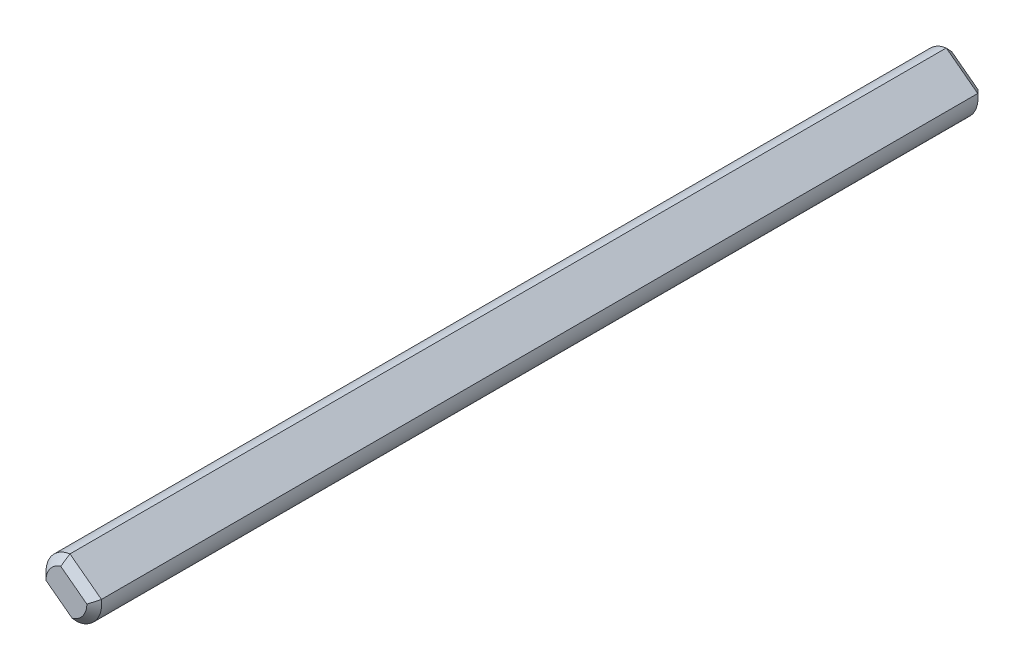
ISO-10303-21;
HEADER;
FILE_DESCRIPTION(('STEP AP214'),'2;1');
FILE_NAME('part.step','',(''),(''),'','','');
FILE_SCHEMA(('AUTOMOTIVE_DESIGN { 1 0 10303 214 1 1 1 1 }'));
ENDSEC;
DATA;
#1=APPLICATION_CONTEXT('core data for automotive mechanical design processes');
#2=APPLICATION_PROTOCOL_DEFINITION('international standard','automotive_design',2000,#1);
#3=PRODUCT_CONTEXT('',#1,'mechanical');
#4=PRODUCT('Part','Part','',(#3));
#5=PRODUCT_RELATED_PRODUCT_CATEGORY('part','',(#4));
#6=PRODUCT_DEFINITION_FORMATION('','',#4);
#7=PRODUCT_DEFINITION_CONTEXT('part definition',#1,'design');
#8=PRODUCT_DEFINITION('design','',#6,#7);
#9=PRODUCT_DEFINITION_SHAPE('','',#8);
#10=(LENGTH_UNIT() NAMED_UNIT(*) SI_UNIT(.MILLI.,.METRE.));
#11=(NAMED_UNIT(*) PLANE_ANGLE_UNIT() SI_UNIT($,.RADIAN.));
#12=(NAMED_UNIT(*) SI_UNIT($,.STERADIAN.) SOLID_ANGLE_UNIT());
#13=UNCERTAINTY_MEASURE_WITH_UNIT(LENGTH_MEASURE(1.E-05),#10,'distance_accuracy_value','');
#14=(GEOMETRIC_REPRESENTATION_CONTEXT(3) GLOBAL_UNCERTAINTY_ASSIGNED_CONTEXT((#13)) GLOBAL_UNIT_ASSIGNED_CONTEXT((#10,
#11,#12)) REPRESENTATION_CONTEXT('',''));
#15=CARTESIAN_POINT('',(0.,0.,0.));
#16=DIRECTION('',(0.,0.,1.));
#17=DIRECTION('',(1.,0.,0.));
#18=AXIS2_PLACEMENT_3D('',#15,#16,#17);
#19=CARTESIAN_POINT('',(-4.13463688797048,-5.48954506721514,120.));
#20=DIRECTION('',(0.601626417089514,0.798777599998919,0.));
#21=DIRECTION('',(-0.798777599998919,0.601626417089514,0.));
#22=AXIS2_PLACEMENT_3D('',#19,#20,#21);
#23=PLANE('',#22);
#24=DIRECTION('',(0.,0.,-1.));
#25=VECTOR('',#24,1.);
#26=CARTESIAN_POINT('',(-20.4167449950073,6.77387639467103,120.));
#27=LINE('',#26,#25);
#28=CARTESIAN_POINT('',(-20.4167449950073,6.77387639467103,119.));
#29=VERTEX_POINT('',#28);
#30=CARTESIAN_POINT('',(-20.4167449950073,6.77387639467103,1.));
#31=VERTEX_POINT('',#30);
#32=EDGE_CURVE('E141',#29,#31,#27,.T.);
#33=ORIENTED_EDGE('',*,*,#32,.F.);
#34=DIRECTION('',(0.798777599998919,-0.601626417089514,0.));
#35=VECTOR('',#34,1.);
#36=CARTESIAN_POINT('',(-4.13463688797048,-5.48954506721514,119.));
#37=LINE('',#36,#35);
#38=CARTESIAN_POINT('',(-16.1805870628636,3.58327050018382,119.));
#39=VERTEX_POINT('',#38);
#40=EDGE_CURVE('E174',#29,#39,#37,.T.);
#41=ORIENTED_EDGE('',*,*,#40,.T.);
#42=DIRECTION('',(0.,0.,-1.));
#43=VECTOR('',#42,1.);
#44=CARTESIAN_POINT('',(-16.1805870628636,3.58327050018382,120.));
#45=LINE('',#44,#43);
#46=CARTESIAN_POINT('',(-16.1805870628636,3.58327050018382,1.));
#47=VERTEX_POINT('',#46);
#48=EDGE_CURVE('E227',#39,#47,#45,.T.);
#49=ORIENTED_EDGE('',*,*,#48,.T.);
#50=DIRECTION('',(-0.798777599998919,0.601626417089514,0.));
#51=VECTOR('',#50,1.);
#52=CARTESIAN_POINT('',(-20.4167449950073,6.77387639467103,0.999999999999998));
#53=LINE('',#52,#51);
#54=EDGE_CURVE('E171',#47,#31,#53,.T.);
#55=ORIENTED_EDGE('',*,*,#54,.T.);
#56=EDGE_LOOP('',(#33,#41,#49,#55));
#57=FACE_BOUND('',#56,.T.);
#58=ADVANCED_FACE('F47',(#57),#23,.T.);
#59=CARTESIAN_POINT('',(-19.8939689761791,3.06049448135561,120.));
#60=DIRECTION('',(0.,0.,-1.));
#61=DIRECTION('',(-1.,0.,0.));
#62=AXIS2_PLACEMENT_3D('',#59,#60,#61);
#63=CYLINDRICAL_SURFACE('',#62,3.75);
#64=DIRECTION('',(0.,0.,-1.));
#65=VECTOR('',#64,1.);
#66=CARTESIAN_POINT('',(-23.6073508894945,2.5377184625274,120.));
#67=LINE('',#66,#65);
#68=CARTESIAN_POINT('',(-23.6073508894945,2.5377184625274,119.));
#69=VERTEX_POINT('',#68);
#70=CARTESIAN_POINT('',(-23.6073508894945,2.5377184625274,1.));
#71=VERTEX_POINT('',#70);
#72=EDGE_CURVE('E434',#69,#71,#67,.T.);
#73=ORIENTED_EDGE('',*,*,#72,.F.);
#74=CARTESIAN_POINT('',(-19.8939689761791,3.06049448135561,119.));
#75=DIRECTION('',(0.,0.,1.));
#76=DIRECTION('',(1.,0.,0.));
#77=AXIS2_PLACEMENT_3D('',#74,#75,#76);
#78=CIRCLE('',#77,3.75);
#79=EDGE_CURVE('E168',#69,#29,#78,.F.);
#80=ORIENTED_EDGE('',*,*,#79,.T.);
#81=ORIENTED_EDGE('',*,*,#32,.T.);
#82=CARTESIAN_POINT('',(-19.8939689761791,3.06049448135561,1.));
#83=DIRECTION('',(0.,0.,1.));
#84=DIRECTION('',(1.,0.,0.));
#85=AXIS2_PLACEMENT_3D('',#82,#83,#84);
#86=CIRCLE('',#85,3.75);
#87=EDGE_CURVE('E164',#31,#71,#86,.T.);
#88=ORIENTED_EDGE('',*,*,#87,.T.);
#89=EDGE_LOOP('',(#73,#80,#81,#88));
#90=FACE_BOUND('',#89,.T.);
#91=ADVANCED_FACE('F272',(#90),#63,.T.);
#92=CARTESIAN_POINT('',(-7.32524278245773,-9.72570299935879,120.));
#93=DIRECTION('',(-0.601626417089516,-0.798777599998918,0.));
#94=DIRECTION('',(0.798777599998919,-0.601626417089516,0.));
#95=AXIS2_PLACEMENT_3D('',#92,#93,#94);
#96=PLANE('',#95);
#97=DIRECTION('',(0.,0.,-1.));
#98=VECTOR('',#97,1.);
#99=CARTESIAN_POINT('',(-19.3711929573509,-0.652887431959822,120.));
#100=LINE('',#99,#98);
#101=CARTESIAN_POINT('',(-19.3711929573509,-0.652887431959822,119.));
#102=VERTEX_POINT('',#101);
#103=CARTESIAN_POINT('',(-19.3711929573509,-0.652887431959822,1.));
#104=VERTEX_POINT('',#103);
#105=EDGE_CURVE('E430',#102,#104,#100,.T.);
#106=ORIENTED_EDGE('',*,*,#105,.F.);
#107=DIRECTION('',(-0.798777599998919,0.601626417089516,0.));
#108=VECTOR('',#107,1.);
#109=CARTESIAN_POINT('',(-7.32524278245773,-9.72570299935879,119.));
#110=LINE('',#109,#108);
#111=EDGE_CURVE('E162',#102,#69,#110,.T.);
#112=ORIENTED_EDGE('',*,*,#111,.T.);
#113=ORIENTED_EDGE('',*,*,#72,.T.);
#114=DIRECTION('',(0.798777599998919,-0.601626417089516,0.));
#115=VECTOR('',#114,1.);
#116=CARTESIAN_POINT('',(-19.3711929573509,-0.652887431959823,1.));
#117=LINE('',#116,#115);
#118=EDGE_CURVE('E159',#71,#104,#117,.T.);
#119=ORIENTED_EDGE('',*,*,#118,.T.);
#120=EDGE_LOOP('',(#106,#112,#113,#119));
#121=FACE_BOUND('',#120,.T.);
#122=ADVANCED_FACE('F277',(#121),#96,.T.);
#123=ORIENTED_EDGE('',*,*,#48,.F.);
#124=CARTESIAN_POINT('',(-19.8939689761791,3.06049448135561,119.));
#125=DIRECTION('',(0.,0.,1.));
#126=DIRECTION('',(1.,0.,0.));
#127=AXIS2_PLACEMENT_3D('',#124,#125,#126);
#128=CIRCLE('',#127,3.75);
#129=EDGE_CURVE('E126',#39,#102,#128,.F.);
#130=ORIENTED_EDGE('',*,*,#129,.T.);
#131=ORIENTED_EDGE('',*,*,#105,.T.);
#132=CARTESIAN_POINT('',(-19.8939689761791,3.06049448135561,1.));
#133=DIRECTION('',(0.,0.,1.));
#134=DIRECTION('',(1.,0.,0.));
#135=AXIS2_PLACEMENT_3D('',#132,#133,#134);
#136=CIRCLE('',#135,3.75);
#137=EDGE_CURVE('E148',#104,#47,#136,.T.);
#138=ORIENTED_EDGE('',*,*,#137,.T.);
#139=EDGE_LOOP('',(#123,#130,#131,#138));
#140=FACE_BOUND('',#139,.T.);
#141=ADVANCED_FACE('F280',(#140),#63,.T.);
#142=CARTESIAN_POINT('',(0.,0.,120.));
#143=DIRECTION('',(0.,0.,1.));
#144=DIRECTION('',(1.,0.,0.));
#145=AXIS2_PLACEMENT_3D('',#142,#143,#144);
#146=PLANE('',#145);
#147=DIRECTION('',(0.798777599998918,-0.601626417089516,0.));
#148=VECTOR('',#147,1.);
#149=CARTESIAN_POINT('',(-6.72361636536821,-8.92692539935987,120.));
#150=LINE('',#149,#148);
#151=CARTESIAN_POINT('',(-22.6439667086819,3.06402594413125,120.));
#152=VERTEX_POINT('',#151);
#153=CARTESIAN_POINT('',(-19.1313243039844,0.418360286434179,120.));
#154=VERTEX_POINT('',#153);
#155=EDGE_CURVE('E145',#152,#154,#150,.T.);
#156=ORIENTED_EDGE('',*,*,#155,.T.);
#157=CARTESIAN_POINT('',(-19.8939689761791,3.06049448135561,120.));
#158=DIRECTION('',(0.,0.,1.));
#159=DIRECTION('',(1.,0.,0.));
#160=AXIS2_PLACEMENT_3D('',#157,#158,#159);
#161=CIRCLE('',#160,2.74999999999999);
#162=CARTESIAN_POINT('',(-17.1439712436762,3.05696301857997,120.));
#163=VERTEX_POINT('',#162);
#164=EDGE_CURVE('E124',#154,#163,#161,.T.);
#165=ORIENTED_EDGE('',*,*,#164,.T.);
#166=DIRECTION('',(-0.798777599998919,0.601626417089514,0.));
#167=VECTOR('',#166,1.);
#168=CARTESIAN_POINT('',(-4.73626330506,-6.28832266721407,120.));
#169=LINE('',#168,#167);
#170=CARTESIAN_POINT('',(-20.6566136483737,5.70262867627704,120.));
#171=VERTEX_POINT('',#170);
#172=EDGE_CURVE('E133',#163,#171,#169,.T.);
#173=ORIENTED_EDGE('',*,*,#172,.T.);
#174=CARTESIAN_POINT('',(-19.8939689761791,3.06049448135561,120.));
#175=DIRECTION('',(0.,0.,1.));
#176=DIRECTION('',(1.,0.,0.));
#177=AXIS2_PLACEMENT_3D('',#174,#175,#176);
#178=CIRCLE('',#177,2.75);
#179=EDGE_CURVE('E140',#171,#152,#178,.T.);
#180=ORIENTED_EDGE('',*,*,#179,.T.);
#181=EDGE_LOOP('',(#156,#165,#173,#180));
#182=FACE_BOUND('',#181,.T.);
#183=ADVANCED_FACE('F143',(#182),#146,.T.);
#184=CARTESIAN_POINT('',(0.,0.,0.));
#185=DIRECTION('',(0.,0.,1.));
#186=DIRECTION('',(1.,0.,0.));
#187=AXIS2_PLACEMENT_3D('',#184,#185,#186);
#188=PLANE('',#187);
#189=DIRECTION('',(-0.798777599998918,0.601626417089516,0.));
#190=VECTOR('',#189,1.);
#191=CARTESIAN_POINT('',(-23.005724472405,3.33649606252632,0.));
#192=LINE('',#191,#190);
#193=CARTESIAN_POINT('',(-19.1313243039844,0.418360286434177,0.));
#194=VERTEX_POINT('',#193);
#195=CARTESIAN_POINT('',(-22.6439667086819,3.06402594413124,0.));
#196=VERTEX_POINT('',#195);
#197=EDGE_CURVE('E63',#194,#196,#192,.T.);
#198=ORIENTED_EDGE('',*,*,#197,.T.);
#199=CARTESIAN_POINT('',(-19.8939689761791,3.06049448135561,0.));
#200=DIRECTION('',(0.,0.,1.));
#201=DIRECTION('',(1.,0.,0.));
#202=AXIS2_PLACEMENT_3D('',#199,#200,#201);
#203=CIRCLE('',#202,2.75);
#204=CARTESIAN_POINT('',(-20.6566136483737,5.70262867627704,0.));
#205=VERTEX_POINT('',#204);
#206=EDGE_CURVE('E11',#196,#205,#203,.F.);
#207=ORIENTED_EDGE('',*,*,#206,.T.);
#208=DIRECTION('',(0.798777599998919,-0.601626417089514,0.));
#209=VECTOR('',#208,1.);
#210=CARTESIAN_POINT('',(-16.7822134799531,2.7844929001849,0.));
#211=LINE('',#210,#209);
#212=CARTESIAN_POINT('',(-17.1439712436762,3.05696301857998,0.));
#213=VERTEX_POINT('',#212);
#214=EDGE_CURVE('E177',#205,#213,#211,.T.);
#215=ORIENTED_EDGE('',*,*,#214,.T.);
#216=CARTESIAN_POINT('',(-19.8939689761791,3.06049448135561,0.));
#217=DIRECTION('',(0.,0.,1.));
#218=DIRECTION('',(1.,0.,0.));
#219=AXIS2_PLACEMENT_3D('',#216,#217,#218);
#220=CIRCLE('',#219,2.75);
#221=EDGE_CURVE('E74',#213,#194,#220,.F.);
#222=ORIENTED_EDGE('',*,*,#221,.T.);
#223=EDGE_LOOP('',(#198,#207,#215,#222));
#224=FACE_BOUND('',#223,.T.);
#225=ADVANCED_FACE('F288',(#224),#188,.F.);
#226=CARTESIAN_POINT('',(-19.8939689761791,3.06049448135561,120.));
#227=DIRECTION('',(0.,0.,-1.));
#228=DIRECTION('',(-1.,0.,0.));
#229=AXIS2_PLACEMENT_3D('',#226,#227,#228);
#230=CONICAL_SURFACE('',#229,2.74999999999999,0.785398163397443);
#231=CARTESIAN_POINT('',(-20.4167449950073,6.77387639467103,119.));
#232=CARTESIAN_POINT('',(-20.4394814246317,6.68585597824511,119.083987573676));
#233=CARTESIAN_POINT('',(-20.4616448685273,6.59756330900758,119.167847893448));
#234=CARTESIAN_POINT('',(-20.5046589579363,6.42038941817363,119.335248841247));
#235=CARTESIAN_POINT('',(-20.5255098435853,6.3315083075416,119.418789525109));
#236=CARTESIAN_POINT('',(-20.5657418231416,6.1530751523399,119.585522554294));
#237=CARTESIAN_POINT('',(-20.5851228168197,6.06352306247407,119.668714875498));
#238=CARTESIAN_POINT('',(-20.6221936992378,5.88366023134805,119.834688098241));
#239=CARTESIAN_POINT('',(-20.6398832763401,5.79334935360552,119.91746892131));
#240=CARTESIAN_POINT('',(-20.6566136483737,5.70262867627704,120.));
#241=B_SPLINE_CURVE_WITH_KNOTS('',3,(#231,#232,#233,#234,#235,#236,#237,#238,#239,#240),
.UNSPECIFIED.,.F.,.F.,(4,2,2,2,4),(0.,0.371304347450878,0.742540565331989,1.11380207441254,
1.48513185589644),.UNSPECIFIED.);
#242=EDGE_CURVE('E136',#29,#171,#241,.T.);
#243=ORIENTED_EDGE('',*,*,#242,.F.);
#244=ORIENTED_EDGE('',*,*,#79,.F.);
#245=CARTESIAN_POINT('',(-23.6073508894945,2.5377184625274,119.));
#246=CARTESIAN_POINT('',(-23.5290290330575,2.58387283116276,119.083987573676));
#247=CARTESIAN_POINT('',(-23.4502873095119,2.62955165185092,119.167847893448));
#248=CARTESIAN_POINT('',(-23.2918757340383,2.71981001565679,119.335248841247));
#249=CARTESIAN_POINT('',(-23.212206055061,2.76438975893988,119.418789525109));
#250=CARTESIAN_POINT('',(-23.0518160446991,2.85232182152426,119.585522554294));
#251=CARTESIAN_POINT('',(-22.9710956421064,2.89567405699795,119.668714875498));
#252=CARTESIAN_POINT('',(-22.8084587738607,2.98096261092611,119.834688098241));
#253=CARTESIAN_POINT('',(-22.7265420909897,3.02289866753726,119.91746892131));
#254=CARTESIAN_POINT('',(-22.6439667086819,3.06402594413125,120.));
#255=B_SPLINE_CURVE_WITH_KNOTS('',3,(#245,#246,#247,#248,#249,#250,#251,#252,#253,#254),
.UNSPECIFIED.,.F.,.F.,(4,2,2,2,4),(0.,0.37130434745088,0.742540565331995,1.11380207441255,
1.48513185589644),.UNSPECIFIED.);
#256=EDGE_CURVE('E219',#152,#69,#255,.F.);
#257=ORIENTED_EDGE('',*,*,#256,.F.);
#258=ORIENTED_EDGE('',*,*,#179,.F.);
#259=EDGE_LOOP('',(#243,#244,#257,#258));
#260=FACE_BOUND('',#259,.T.);
#261=ADVANCED_FACE('F213',(#260),#230,.T.);
#262=CARTESIAN_POINT('',(-7.32524278245773,-9.72570299935879,119.));
#263=DIRECTION('',(0.425414119264964,0.564821057619153,-0.707106781186545));
#264=DIRECTION('',(-0.798777599998919,0.601626417089516,0.));
#265=AXIS2_PLACEMENT_3D('',#262,#263,#264);
#266=PLANE('',#265);
#267=ORIENTED_EDGE('',*,*,#256,.T.);
#268=ORIENTED_EDGE('',*,*,#111,.F.);
#269=CARTESIAN_POINT('',(-19.3711929573509,-0.652887431959819,119.));
#270=CARTESIAN_POINT('',(-19.3484565277264,-0.564867015533895,119.083987573676));
#271=CARTESIAN_POINT('',(-19.3262930838308,-0.476574346296363,119.167847893448));
#272=CARTESIAN_POINT('',(-19.2832789944218,-0.299400455462417,119.335248841247));
#273=CARTESIAN_POINT('',(-19.2624281087729,-0.210519344830382,119.418789525109));
#274=CARTESIAN_POINT('',(-19.2221961292166,-0.0320861896286836,119.585522554294));
#275=CARTESIAN_POINT('',(-19.2028151355384,0.0574659002371548,119.668714875498));
#276=CARTESIAN_POINT('',(-19.1657442531203,0.237328731363176,119.834688098241));
#277=CARTESIAN_POINT('',(-19.1480546760181,0.327639609105709,119.91746892131));
#278=CARTESIAN_POINT('',(-19.1313243039844,0.418360286434178,120.));
#279=B_SPLINE_CURVE_WITH_KNOTS('',3,(#269,#270,#271,#272,#273,#274,#275,#276,#277,#278),
.UNSPECIFIED.,.F.,.F.,(4,2,2,2,4),(0.,0.371304347450878,0.742540565331989,1.11380207441255,
1.48513185589644),.UNSPECIFIED.);
#280=EDGE_CURVE('E130',#154,#102,#279,.F.);
#281=ORIENTED_EDGE('',*,*,#280,.F.);
#282=ORIENTED_EDGE('',*,*,#155,.F.);
#283=EDGE_LOOP('',(#267,#268,#281,#282));
#284=FACE_BOUND('',#283,.T.);
#285=ADVANCED_FACE('F205',(#284),#266,.F.);
#286=CARTESIAN_POINT('',(-4.13463688797048,-5.48954506721514,119.));
#287=DIRECTION('',(-0.425414119264963,-0.564821057619153,-0.707106781186545));
#288=DIRECTION('',(0.798777599998919,-0.601626417089514,0.));
#289=AXIS2_PLACEMENT_3D('',#286,#287,#288);
#290=PLANE('',#289);
#291=ORIENTED_EDGE('',*,*,#242,.T.);
#292=ORIENTED_EDGE('',*,*,#172,.F.);
#293=CARTESIAN_POINT('',(-17.1439712436762,3.05696301857997,120.));
#294=CARTESIAN_POINT('',(-17.0613958613684,3.09809029517396,119.91746892131));
#295=CARTESIAN_POINT('',(-16.9794791784974,3.14002635178512,119.834688098241));
#296=CARTESIAN_POINT('',(-16.8168423102517,3.22531490571327,119.668714875498));
#297=CARTESIAN_POINT('',(-16.736121907659,3.26866714118696,119.585522554294));
#298=CARTESIAN_POINT('',(-16.5757318972971,3.35659920377134,119.418789525109));
#299=CARTESIAN_POINT('',(-16.4960622183198,3.40117894705443,119.335248841247));
#300=CARTESIAN_POINT('',(-16.3376506428462,3.4914373108603,119.167847893448));
#301=CARTESIAN_POINT('',(-16.2589089193006,3.53711613154847,119.083987573676));
#302=CARTESIAN_POINT('',(-16.1805870628636,3.58327050018383,119.));
#303=B_SPLINE_CURVE_WITH_KNOTS('',3,(#293,#294,#295,#296,#297,#298,#299,#300,#301,#302),
.UNSPECIFIED.,.F.,.F.,(4,2,2,2,4),(0.,0.371329781483893,0.742591290564448,1.11382750844556,
1.48513185589645),.UNSPECIFIED.);
#304=EDGE_CURVE('E120',#39,#163,#303,.F.);
#305=ORIENTED_EDGE('',*,*,#304,.F.);
#306=ORIENTED_EDGE('',*,*,#40,.F.);
#307=EDGE_LOOP('',(#291,#292,#305,#306));
#308=FACE_BOUND('',#307,.T.);
#309=ADVANCED_FACE('F134',(#308),#290,.F.);
#310=CARTESIAN_POINT('',(-19.8939689761791,3.06049448135561,120.));
#311=DIRECTION('',(0.,0.,-1.));
#312=DIRECTION('',(-1.,0.,0.));
#313=AXIS2_PLACEMENT_3D('',#310,#311,#312);
#314=CONICAL_SURFACE('',#313,2.74999999999999,0.785398163397444);
#315=ORIENTED_EDGE('',*,*,#280,.T.);
#316=ORIENTED_EDGE('',*,*,#129,.F.);
#317=ORIENTED_EDGE('',*,*,#304,.T.);
#318=ORIENTED_EDGE('',*,*,#164,.F.);
#319=EDGE_LOOP('',(#315,#316,#317,#318));
#320=FACE_BOUND('',#319,.T.);
#321=ADVANCED_FACE('F122',(#320),#314,.T.);
#322=CARTESIAN_POINT('',(-19.8939689761791,3.06049448135561,1.));
#323=DIRECTION('',(0.,0.,1.));
#324=DIRECTION('',(1.,0.,0.));
#325=AXIS2_PLACEMENT_3D('',#322,#323,#324);
#326=CONICAL_SURFACE('',#325,3.75,0.78539816339745);
#327=CARTESIAN_POINT('',(-19.3711929573509,-0.652887431959819,1.));
#328=CARTESIAN_POINT('',(-19.3484565277264,-0.564867015533898,0.916012426324013));
#329=CARTESIAN_POINT('',(-19.3262930838308,-0.476574346296368,0.832152106551726));
#330=CARTESIAN_POINT('',(-19.2832789944218,-0.299400455462421,0.664751158753382));
#331=CARTESIAN_POINT('',(-19.2624281087729,-0.210519344830384,0.581210474891373));
#332=CARTESIAN_POINT('',(-19.2221961292166,-0.0320861896286849,0.414477445706256));
#333=CARTESIAN_POINT('',(-19.2028151355385,0.0574659002371522,0.331285124502135));
#334=CARTESIAN_POINT('',(-19.1657442531203,0.237328731363172,0.165311901758703));
#335=CARTESIAN_POINT('',(-19.1480546760181,0.327639609105705,0.0825310786898855));
#336=CARTESIAN_POINT('',(-19.1313243039844,0.418360286434176,0.));
#337=B_SPLINE_CURVE_WITH_KNOTS('',3,(#327,#328,#329,#330,#331,#332,#333,#334,#335,#336),
.UNSPECIFIED.,.F.,.F.,(4,2,2,2,4),(0.,0.371304347450866,0.742540565331981,1.11380207441254,
1.48513185589643),.UNSPECIFIED.);
#338=EDGE_CURVE('E445',#194,#104,#337,.F.);
#339=ORIENTED_EDGE('',*,*,#338,.F.);
#340=ORIENTED_EDGE('',*,*,#221,.F.);
#341=CARTESIAN_POINT('',(-16.1805870628636,3.58327050018382,1.));
#342=CARTESIAN_POINT('',(-16.2589089193006,3.53711613154847,0.916012426324014));
#343=CARTESIAN_POINT('',(-16.3376506428462,3.4914373108603,0.832152106551729));
#344=CARTESIAN_POINT('',(-16.4960622183198,3.40117894705444,0.664751158753385));
#345=CARTESIAN_POINT('',(-16.5757318972971,3.35659920377135,0.581210474891375));
#346=CARTESIAN_POINT('',(-16.736121907659,3.26866714118697,0.414477445706258));
#347=CARTESIAN_POINT('',(-16.8168423102517,3.22531490571327,0.331285124502136));
#348=CARTESIAN_POINT('',(-16.9794791784974,3.14002635178512,0.165311901758704));
#349=CARTESIAN_POINT('',(-17.0613958613684,3.09809029517397,0.0825310786898869));
#350=CARTESIAN_POINT('',(-17.1439712436762,3.05696301857998,0.));
#351=B_SPLINE_CURVE_WITH_KNOTS('',3,(#341,#342,#343,#344,#345,#346,#347,#348,#349,#350),
.UNSPECIFIED.,.F.,.F.,(4,2,2,2,4),(0.,0.371304347450863,0.742540565331978,1.11380207441254,
1.48513185589643),.UNSPECIFIED.);
#352=EDGE_CURVE('E53',#47,#213,#351,.T.);
#353=ORIENTED_EDGE('',*,*,#352,.F.);
#354=ORIENTED_EDGE('',*,*,#137,.F.);
#355=EDGE_LOOP('',(#339,#340,#353,#354));
#356=FACE_BOUND('',#355,.T.);
#357=ADVANCED_FACE('F50',(#356),#326,.T.);
#358=CARTESIAN_POINT('',(-4.73626330506,-6.28832266721406,0.));
#359=DIRECTION('',(0.425414119264961,0.564821057619151,-0.707106781186548));
#360=DIRECTION('',(-0.798777599998919,0.601626417089514,0.));
#361=AXIS2_PLACEMENT_3D('',#358,#359,#360);
#362=PLANE('',#361);
#363=ORIENTED_EDGE('',*,*,#352,.T.);
#364=ORIENTED_EDGE('',*,*,#214,.F.);
#365=CARTESIAN_POINT('',(-20.6566136483737,5.70262867627704,0.));
#366=CARTESIAN_POINT('',(-20.6398832763401,5.79334935360551,0.0825310786898854));
#367=CARTESIAN_POINT('',(-20.6221936992378,5.88366023134804,0.165311901758703));
#368=CARTESIAN_POINT('',(-20.5851228168197,6.06352306247406,0.331285124502134));
#369=CARTESIAN_POINT('',(-20.5657418231416,6.1530751523399,0.414477445706256));
#370=CARTESIAN_POINT('',(-20.5255098435853,6.3315083075416,0.581210474891373));
#371=CARTESIAN_POINT('',(-20.5046589579363,6.42038941817364,0.664751158753383));
#372=CARTESIAN_POINT('',(-20.4616448685273,6.59756330900758,0.832152106551727));
#373=CARTESIAN_POINT('',(-20.4394814246317,6.68585597824511,0.916012426324013));
#374=CARTESIAN_POINT('',(-20.4167449950073,6.77387639467103,1.));
#375=B_SPLINE_CURVE_WITH_KNOTS('',3,(#365,#366,#367,#368,#369,#370,#371,#372,#373,#374),
.UNSPECIFIED.,.F.,.F.,(4,2,2,2,4),(0.,0.37132978148389,0.742591290564449,1.11382750844556,
1.48513185589643),.UNSPECIFIED.);
#376=EDGE_CURVE('E240',#31,#205,#375,.F.);
#377=ORIENTED_EDGE('',*,*,#376,.F.);
#378=ORIENTED_EDGE('',*,*,#54,.F.);
#379=EDGE_LOOP('',(#363,#364,#377,#378));
#380=FACE_BOUND('',#379,.T.);
#381=ADVANCED_FACE('F256',(#380),#362,.T.);
#382=CARTESIAN_POINT('',(-6.72361636536821,-8.92692539935987,0.));
#383=DIRECTION('',(-0.425414119264962,-0.56482105761915,-0.707106781186549));
#384=DIRECTION('',(0.798777599998919,-0.601626417089516,0.));
#385=AXIS2_PLACEMENT_3D('',#382,#383,#384);
#386=PLANE('',#385);
#387=ORIENTED_EDGE('',*,*,#338,.T.);
#388=ORIENTED_EDGE('',*,*,#118,.F.);
#389=CARTESIAN_POINT('',(-23.6073508894945,2.5377184625274,1.));
#390=CARTESIAN_POINT('',(-23.5290290330575,2.58387283116275,0.916012426324012));
#391=CARTESIAN_POINT('',(-23.4502873095119,2.62955165185092,0.832152106551725));
#392=CARTESIAN_POINT('',(-23.2918757340383,2.71981001565678,0.664751158753381));
#393=CARTESIAN_POINT('',(-23.212206055061,2.76438975893988,0.581210474891372));
#394=CARTESIAN_POINT('',(-23.0518160446991,2.85232182152425,0.414477445706255));
#395=CARTESIAN_POINT('',(-22.9710956421064,2.89567405699795,0.331285124502133));
#396=CARTESIAN_POINT('',(-22.8084587738607,2.9809626109261,0.165311901758701));
#397=CARTESIAN_POINT('',(-22.7265420909897,3.02289866753726,0.0825310786898835));
#398=CARTESIAN_POINT('',(-22.6439667086819,3.06402594413124,0.));
#399=B_SPLINE_CURVE_WITH_KNOTS('',3,(#389,#390,#391,#392,#393,#394,#395,#396,#397,#398),
.UNSPECIFIED.,.F.,.F.,(4,2,2,2,4),(0.,0.371304347450868,0.742540565331982,1.11380207441254,
1.48513185589643),.UNSPECIFIED.);
#400=EDGE_CURVE('E232',#196,#71,#399,.F.);
#401=ORIENTED_EDGE('',*,*,#400,.F.);
#402=ORIENTED_EDGE('',*,*,#197,.F.);
#403=EDGE_LOOP('',(#387,#388,#401,#402));
#404=FACE_BOUND('',#403,.T.);
#405=ADVANCED_FACE('F246',(#404),#386,.T.);
#406=CARTESIAN_POINT('',(-19.8939689761791,3.06049448135561,1.));
#407=DIRECTION('',(0.,0.,1.));
#408=DIRECTION('',(1.,0.,0.));
#409=AXIS2_PLACEMENT_3D('',#406,#407,#408);
#410=CONICAL_SURFACE('',#409,3.75,0.78539816339745);
#411=ORIENTED_EDGE('',*,*,#376,.T.);
#412=ORIENTED_EDGE('',*,*,#206,.F.);
#413=ORIENTED_EDGE('',*,*,#400,.T.);
#414=ORIENTED_EDGE('',*,*,#87,.F.);
#415=EDGE_LOOP('',(#411,#412,#413,#414));
#416=FACE_BOUND('',#415,.T.);
#417=ADVANCED_FACE('F249',(#416),#410,.T.);
#418=CLOSED_SHELL('',(#58,#91,#122,#141,#183,#225,#261,#285,#309,#321,#357,#381,#405,#417));
#419=MANIFOLD_SOLID_BREP('B2',#418);
#420=ADVANCED_BREP_SHAPE_REPRESENTATION('',(#18,#419),#14);
#421=SHAPE_DEFINITION_REPRESENTATION(#9,#420);
ENDSEC;
END-ISO-10303-21;
